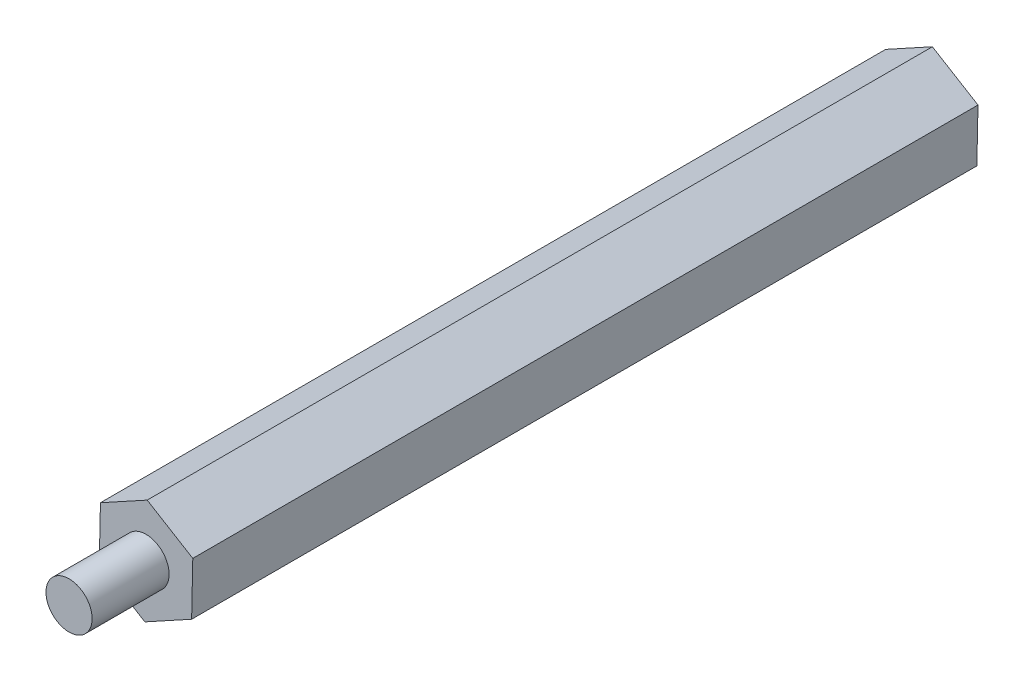
ISO-10303-21;
HEADER;
FILE_DESCRIPTION(('STEP AP214'),'2;1');
FILE_NAME('part.step','',(''),(''),'','','');
FILE_SCHEMA(('AUTOMOTIVE_DESIGN { 1 0 10303 214 1 1 1 1 }'));
ENDSEC;
DATA;
#1=APPLICATION_CONTEXT('core data for automotive mechanical design processes');
#2=APPLICATION_PROTOCOL_DEFINITION('international standard','automotive_design',2000,#1);
#3=PRODUCT_CONTEXT('',#1,'mechanical');
#4=PRODUCT('Part','Part','',(#3));
#5=PRODUCT_RELATED_PRODUCT_CATEGORY('part','',(#4));
#6=PRODUCT_DEFINITION_FORMATION('','',#4);
#7=PRODUCT_DEFINITION_CONTEXT('part definition',#1,'design');
#8=PRODUCT_DEFINITION('design','',#6,#7);
#9=PRODUCT_DEFINITION_SHAPE('','',#8);
#10=(LENGTH_UNIT() NAMED_UNIT(*) SI_UNIT(.MILLI.,.METRE.));
#11=(NAMED_UNIT(*) PLANE_ANGLE_UNIT() SI_UNIT($,.RADIAN.));
#12=(NAMED_UNIT(*) SI_UNIT($,.STERADIAN.) SOLID_ANGLE_UNIT());
#13=UNCERTAINTY_MEASURE_WITH_UNIT(LENGTH_MEASURE(1.E-05),#10,'distance_accuracy_value','');
#14=(GEOMETRIC_REPRESENTATION_CONTEXT(3) GLOBAL_UNCERTAINTY_ASSIGNED_CONTEXT((#13)) GLOBAL_UNIT_ASSIGNED_CONTEXT((#10,
#11,#12)) REPRESENTATION_CONTEXT('',''));
#15=CARTESIAN_POINT('',(0.,0.,0.));
#16=DIRECTION('',(0.,0.,1.));
#17=DIRECTION('',(1.,0.,0.));
#18=AXIS2_PLACEMENT_3D('',#15,#16,#17);
#19=CARTESIAN_POINT('',(16.5868309752007,13.0265330086215,2.5));
#20=DIRECTION('',(0.,0.,1.));
#21=DIRECTION('',(1.,0.,0.));
#22=AXIS2_PLACEMENT_3D('',#19,#20,#21);
#23=PLANE('',#22);
#24=CARTESIAN_POINT('',(16.5868309752007,13.0265330086215,2.5));
#25=DIRECTION('',(0.,0.,1.));
#26=DIRECTION('',(-1.,0.,0.));
#27=AXIS2_PLACEMENT_3D('',#24,#25,#26);
#28=CIRCLE('',#27,1.5);
#29=CARTESIAN_POINT('',(18.0868309752007,13.0265330086215,2.5));
#30=VERTEX_POINT('',#29);
#31=EDGE_CURVE('E146',#30,#30,#28,.T.);
#32=ORIENTED_EDGE('',*,*,#31,.T.);
#33=EDGE_LOOP('',(#32));
#34=FACE_BOUND('',#33,.T.);
#35=DIRECTION('',(0.0216605255586804,0.999765383293762,0.));
#36=VECTOR('',#35,1.);
#37=CARTESIAN_POINT('',(19.5486099942957,11.2299069924321,2.5));
#38=LINE('',#37,#36);
#39=CARTESIAN_POINT('',(19.5486099942957,11.2299069924321,2.5));
#40=VERTEX_POINT('',#39);
#41=CARTESIAN_POINT('',(19.6236442558682,14.6931958714589,2.5));
#42=VERTEX_POINT('',#41);
#43=EDGE_CURVE('E27',#40,#42,#38,.T.);
#44=ORIENTED_EDGE('',*,*,#43,.F.);
#45=DIRECTION('',(0.876652482536024,0.481124126253741,0.));
#46=VECTOR('',#45,1.);
#47=CARTESIAN_POINT('',(16.5117967136281,9.56324412959481,2.5));
#48=LINE('',#47,#46);
#49=CARTESIAN_POINT('',(16.5117967136281,9.56324412959481,2.5));
#50=VERTEX_POINT('',#49);
#51=EDGE_CURVE('E110',#50,#40,#48,.T.);
#52=ORIENTED_EDGE('',*,*,#51,.F.);
#53=DIRECTION('',(0.854991956977344,-0.51864125704002,0.));
#54=VECTOR('',#53,1.);
#55=CARTESIAN_POINT('',(13.5500176945331,11.3598701457842,2.5));
#56=LINE('',#55,#54);
#57=CARTESIAN_POINT('',(13.5500176945331,11.3598701457842,2.5));
#58=VERTEX_POINT('',#57);
#59=EDGE_CURVE('E150',#58,#50,#56,.T.);
#60=ORIENTED_EDGE('',*,*,#59,.F.);
#61=DIRECTION('',(-0.0216605255586804,-0.999765383293762,0.));
#62=VECTOR('',#61,1.);
#63=CARTESIAN_POINT('',(13.6250519561057,14.823159024811,2.5));
#64=LINE('',#63,#62);
#65=CARTESIAN_POINT('',(13.6250519561057,14.823159024811,2.5));
#66=VERTEX_POINT('',#65);
#67=EDGE_CURVE('E62',#66,#58,#64,.T.);
#68=ORIENTED_EDGE('',*,*,#67,.F.);
#69=DIRECTION('',(-0.876652482536024,-0.481124126253741,0.));
#70=VECTOR('',#69,1.);
#71=CARTESIAN_POINT('',(16.6618652367732,16.4898218876483,2.5));
#72=LINE('',#71,#70);
#73=CARTESIAN_POINT('',(16.6618652367732,16.4898218876483,2.5));
#74=VERTEX_POINT('',#73);
#75=EDGE_CURVE('E182',#74,#66,#72,.T.);
#76=ORIENTED_EDGE('',*,*,#75,.F.);
#77=DIRECTION('',(-0.854991956977344,0.51864125704002,0.));
#78=VECTOR('',#77,1.);
#79=CARTESIAN_POINT('',(19.6236442558682,14.6931958714589,2.5));
#80=LINE('',#79,#78);
#81=EDGE_CURVE('E112',#42,#74,#80,.T.);
#82=ORIENTED_EDGE('',*,*,#81,.F.);
#83=EDGE_LOOP('',(#44,#52,#60,#68,#76,#82));
#84=FACE_BOUND('',#83,.T.);
#85=ADVANCED_FACE('F16',(#34,#84),#23,.F.);
#86=CARTESIAN_POINT('',(16.5868309752007,13.0265330086215,53.5));
#87=DIRECTION('',(0.,0.,1.));
#88=DIRECTION('',(1.,0.,0.));
#89=AXIS2_PLACEMENT_3D('',#86,#87,#88);
#90=PLANE('',#89);
#91=CARTESIAN_POINT('',(16.5868309752007,13.0265330086215,53.5));
#92=DIRECTION('',(0.,0.,-1.));
#93=DIRECTION('',(-1.,0.,0.));
#94=AXIS2_PLACEMENT_3D('',#91,#92,#93);
#95=CIRCLE('',#94,1.5);
#96=CARTESIAN_POINT('',(18.0868309752007,13.0265330086215,53.5));
#97=VERTEX_POINT('',#96);
#98=EDGE_CURVE('E145',#97,#97,#95,.T.);
#99=ORIENTED_EDGE('',*,*,#98,.T.);
#100=EDGE_LOOP('',(#99));
#101=FACE_BOUND('',#100,.T.);
#102=DIRECTION('',(0.0216605255586804,0.999765383293762,0.));
#103=VECTOR('',#102,1.);
#104=CARTESIAN_POINT('',(19.5486099942957,11.2299069924321,53.5));
#105=LINE('',#104,#103);
#106=CARTESIAN_POINT('',(19.5486099942957,11.2299069924321,53.5));
#107=VERTEX_POINT('',#106);
#108=CARTESIAN_POINT('',(19.6236442558682,14.6931958714589,53.5));
#109=VERTEX_POINT('',#108);
#110=EDGE_CURVE('E11',#107,#109,#105,.T.);
#111=ORIENTED_EDGE('',*,*,#110,.T.);
#112=DIRECTION('',(-0.854991956977344,0.51864125704002,0.));
#113=VECTOR('',#112,1.);
#114=CARTESIAN_POINT('',(19.6236442558682,14.6931958714589,53.5));
#115=LINE('',#114,#113);
#116=CARTESIAN_POINT('',(16.6618652367732,16.4898218876483,53.5));
#117=VERTEX_POINT('',#116);
#118=EDGE_CURVE('E164',#109,#117,#115,.T.);
#119=ORIENTED_EDGE('',*,*,#118,.T.);
#120=DIRECTION('',(-0.876652482536024,-0.481124126253741,0.));
#121=VECTOR('',#120,1.);
#122=CARTESIAN_POINT('',(16.6618652367732,16.4898218876483,53.5));
#123=LINE('',#122,#121);
#124=CARTESIAN_POINT('',(13.6250519561057,14.823159024811,53.5));
#125=VERTEX_POINT('',#124);
#126=EDGE_CURVE('E161',#117,#125,#123,.T.);
#127=ORIENTED_EDGE('',*,*,#126,.T.);
#128=DIRECTION('',(-0.0216605255586804,-0.999765383293762,0.));
#129=VECTOR('',#128,1.);
#130=CARTESIAN_POINT('',(13.6250519561057,14.823159024811,53.5));
#131=LINE('',#130,#129);
#132=CARTESIAN_POINT('',(13.5500176945331,11.3598701457842,53.5));
#133=VERTEX_POINT('',#132);
#134=EDGE_CURVE('E155',#125,#133,#131,.T.);
#135=ORIENTED_EDGE('',*,*,#134,.T.);
#136=DIRECTION('',(0.854991956977344,-0.51864125704002,0.));
#137=VECTOR('',#136,1.);
#138=CARTESIAN_POINT('',(13.5500176945331,11.3598701457842,53.5));
#139=LINE('',#138,#137);
#140=CARTESIAN_POINT('',(16.5117967136281,9.56324412959481,53.5));
#141=VERTEX_POINT('',#140);
#142=EDGE_CURVE('E75',#133,#141,#139,.T.);
#143=ORIENTED_EDGE('',*,*,#142,.T.);
#144=DIRECTION('',(0.876652482536024,0.481124126253741,0.));
#145=VECTOR('',#144,1.);
#146=CARTESIAN_POINT('',(16.5117967136281,9.56324412959481,53.5));
#147=LINE('',#146,#145);
#148=EDGE_CURVE('E124',#141,#107,#147,.T.);
#149=ORIENTED_EDGE('',*,*,#148,.T.);
#150=EDGE_LOOP('',(#111,#119,#127,#135,#143,#149));
#151=FACE_BOUND('',#150,.T.);
#152=ADVANCED_FACE('F204',(#101,#151),#90,.T.);
#153=CARTESIAN_POINT('',(19.5486099942957,11.2299069924321,2.5));
#154=DIRECTION('',(0.999765383293761,-0.0216605255586804,0.));
#155=DIRECTION('',(0.,0.,-1.));
#156=AXIS2_PLACEMENT_3D('',#153,#154,#155);
#157=PLANE('',#156);
#158=ORIENTED_EDGE('',*,*,#43,.T.);
#159=DIRECTION('',(0.,0.,1.));
#160=VECTOR('',#159,1.);
#161=CARTESIAN_POINT('',(19.6236442558682,14.6931958714589,2.5));
#162=LINE('',#161,#160);
#163=EDGE_CURVE('E116',#42,#109,#162,.T.);
#164=ORIENTED_EDGE('',*,*,#163,.T.);
#165=ORIENTED_EDGE('',*,*,#110,.F.);
#166=DIRECTION('',(0.,0.,1.));
#167=VECTOR('',#166,1.);
#168=CARTESIAN_POINT('',(19.5486099942957,11.2299069924321,2.5));
#169=LINE('',#168,#167);
#170=EDGE_CURVE('E119',#40,#107,#169,.T.);
#171=ORIENTED_EDGE('',*,*,#170,.F.);
#172=EDGE_LOOP('',(#158,#164,#165,#171));
#173=FACE_BOUND('',#172,.T.);
#174=ADVANCED_FACE('F120',(#173),#157,.T.);
#175=CARTESIAN_POINT('',(19.6236442558682,14.6931958714589,2.5));
#176=DIRECTION('',(0.51864125704002,0.854991956977344,0.));
#177=DIRECTION('',(0.,0.,-1.));
#178=AXIS2_PLACEMENT_3D('',#175,#176,#177);
#179=PLANE('',#178);
#180=ORIENTED_EDGE('',*,*,#81,.T.);
#181=DIRECTION('',(0.,0.,1.));
#182=VECTOR('',#181,1.);
#183=CARTESIAN_POINT('',(16.6618652367732,16.4898218876483,2.5));
#184=LINE('',#183,#182);
#185=EDGE_CURVE('E157',#74,#117,#184,.T.);
#186=ORIENTED_EDGE('',*,*,#185,.T.);
#187=ORIENTED_EDGE('',*,*,#118,.F.);
#188=ORIENTED_EDGE('',*,*,#163,.F.);
#189=EDGE_LOOP('',(#180,#186,#187,#188));
#190=FACE_BOUND('',#189,.T.);
#191=ADVANCED_FACE('F188',(#190),#179,.T.);
#192=CARTESIAN_POINT('',(16.6618652367732,16.4898218876483,2.5));
#193=DIRECTION('',(-0.481124126253742,0.876652482536024,0.));
#194=DIRECTION('',(0.,0.,1.));
#195=AXIS2_PLACEMENT_3D('',#192,#193,#194);
#196=PLANE('',#195);
#197=ORIENTED_EDGE('',*,*,#75,.T.);
#198=DIRECTION('',(0.,0.,1.));
#199=VECTOR('',#198,1.);
#200=CARTESIAN_POINT('',(13.6250519561057,14.823159024811,2.5));
#201=LINE('',#200,#199);
#202=EDGE_CURVE('E171',#66,#125,#201,.T.);
#203=ORIENTED_EDGE('',*,*,#202,.T.);
#204=ORIENTED_EDGE('',*,*,#126,.F.);
#205=ORIENTED_EDGE('',*,*,#185,.F.);
#206=EDGE_LOOP('',(#197,#203,#204,#205));
#207=FACE_BOUND('',#206,.T.);
#208=ADVANCED_FACE('F192',(#207),#196,.T.);
#209=CARTESIAN_POINT('',(13.6250519561057,14.823159024811,2.5));
#210=DIRECTION('',(-0.999765383293761,0.0216605255586804,0.));
#211=DIRECTION('',(0.,0.,1.));
#212=AXIS2_PLACEMENT_3D('',#209,#210,#211);
#213=PLANE('',#212);
#214=ORIENTED_EDGE('',*,*,#67,.T.);
#215=DIRECTION('',(0.,0.,1.));
#216=VECTOR('',#215,1.);
#217=CARTESIAN_POINT('',(13.5500176945331,11.3598701457842,2.5));
#218=LINE('',#217,#216);
#219=EDGE_CURVE('E156',#58,#133,#218,.T.);
#220=ORIENTED_EDGE('',*,*,#219,.T.);
#221=ORIENTED_EDGE('',*,*,#134,.F.);
#222=ORIENTED_EDGE('',*,*,#202,.F.);
#223=EDGE_LOOP('',(#214,#220,#221,#222));
#224=FACE_BOUND('',#223,.T.);
#225=ADVANCED_FACE('F18',(#224),#213,.T.);
#226=CARTESIAN_POINT('',(13.5500176945331,11.3598701457842,2.5));
#227=DIRECTION('',(-0.51864125704002,-0.854991956977344,0.));
#228=DIRECTION('',(-0.854991956977344,0.51864125704002,0.));
#229=AXIS2_PLACEMENT_3D('',#226,#227,#228);
#230=PLANE('',#229);
#231=ORIENTED_EDGE('',*,*,#59,.T.);
#232=DIRECTION('',(0.,0.,1.));
#233=VECTOR('',#232,1.);
#234=CARTESIAN_POINT('',(16.5117967136281,9.56324412959481,2.5));
#235=LINE('',#234,#233);
#236=EDGE_CURVE('E128',#50,#141,#235,.T.);
#237=ORIENTED_EDGE('',*,*,#236,.T.);
#238=ORIENTED_EDGE('',*,*,#142,.F.);
#239=ORIENTED_EDGE('',*,*,#219,.F.);
#240=EDGE_LOOP('',(#231,#237,#238,#239));
#241=FACE_BOUND('',#240,.T.);
#242=ADVANCED_FACE('F224',(#241),#230,.T.);
#243=CARTESIAN_POINT('',(16.5117967136281,9.56324412959481,2.5));
#244=DIRECTION('',(0.481124126253742,-0.876652482536024,0.));
#245=DIRECTION('',(0.,0.,-1.));
#246=AXIS2_PLACEMENT_3D('',#243,#244,#245);
#247=PLANE('',#246);
#248=ORIENTED_EDGE('',*,*,#51,.T.);
#249=ORIENTED_EDGE('',*,*,#170,.T.);
#250=ORIENTED_EDGE('',*,*,#148,.F.);
#251=ORIENTED_EDGE('',*,*,#236,.F.);
#252=EDGE_LOOP('',(#248,#249,#250,#251));
#253=FACE_BOUND('',#252,.T.);
#254=ADVANCED_FACE('F127',(#253),#247,.T.);
#255=CARTESIAN_POINT('',(16.5868309752007,13.0265330086215,7.5));
#256=DIRECTION('',(0.,0.,1.));
#257=DIRECTION('',(1.,0.,0.));
#258=AXIS2_PLACEMENT_3D('',#255,#256,#257);
#259=PLANE('',#258);
#260=CARTESIAN_POINT('',(16.5868309752007,13.0265330086215,7.5));
#261=DIRECTION('',(0.,0.,1.));
#262=DIRECTION('',(-1.,0.,0.));
#263=AXIS2_PLACEMENT_3D('',#260,#261,#262);
#264=CIRCLE('',#263,1.5);
#265=CARTESIAN_POINT('',(18.0868309752007,13.0265330086215,7.5));
#266=VERTEX_POINT('',#265);
#267=EDGE_CURVE('E130',#266,#266,#264,.T.);
#268=ORIENTED_EDGE('',*,*,#267,.F.);
#269=EDGE_LOOP('',(#268));
#270=FACE_BOUND('',#269,.T.);
#271=ADVANCED_FACE('F230',(#270),#259,.F.);
#272=CARTESIAN_POINT('',(16.5868309752007,13.0265330086215,2.5));
#273=DIRECTION('',(0.,0.,1.));
#274=DIRECTION('',(-1.,0.,0.));
#275=AXIS2_PLACEMENT_3D('',#272,#273,#274);
#276=CYLINDRICAL_SURFACE('',#275,1.5);
#277=ORIENTED_EDGE('',*,*,#31,.F.);
#278=DIRECTION('',(0.,0.,1.));
#279=VECTOR('',#278,1.);
#280=CARTESIAN_POINT('',(18.0868309752007,13.0265330086215,2.5));
#281=LINE('',#280,#279);
#282=EDGE_CURVE('E137',#30,#266,#281,.T.);
#283=ORIENTED_EDGE('',*,*,#282,.T.);
#284=ORIENTED_EDGE('',*,*,#267,.T.);
#285=ORIENTED_EDGE('',*,*,#282,.F.);
#286=EDGE_LOOP('',(#277,#283,#284,#285));
#287=FACE_BOUND('',#286,.T.);
#288=ADVANCED_FACE('F222',(#287),#276,.F.);
#289=CARTESIAN_POINT('',(16.5868309752007,13.0265330086215,58.5));
#290=DIRECTION('',(0.,0.,1.));
#291=DIRECTION('',(1.,0.,0.));
#292=AXIS2_PLACEMENT_3D('',#289,#290,#291);
#293=PLANE('',#292);
#294=CARTESIAN_POINT('',(16.5868309752007,13.0265330086215,58.5));
#295=DIRECTION('',(0.,0.,1.));
#296=DIRECTION('',(-1.,0.,0.));
#297=AXIS2_PLACEMENT_3D('',#294,#295,#296);
#298=CIRCLE('',#297,1.5);
#299=CARTESIAN_POINT('',(18.0868309752007,13.0265330086215,58.5));
#300=VERTEX_POINT('',#299);
#301=EDGE_CURVE('E20',#300,#300,#298,.T.);
#302=ORIENTED_EDGE('',*,*,#301,.T.);
#303=EDGE_LOOP('',(#302));
#304=FACE_BOUND('',#303,.T.);
#305=ADVANCED_FACE('F218',(#304),#293,.T.);
#306=CARTESIAN_POINT('',(16.5868309752007,13.0265330086215,2.5));
#307=DIRECTION('',(0.,0.,1.));
#308=DIRECTION('',(-1.,0.,0.));
#309=AXIS2_PLACEMENT_3D('',#306,#307,#308);
#310=CYLINDRICAL_SURFACE('',#309,1.5);
#311=ORIENTED_EDGE('',*,*,#301,.F.);
#312=DIRECTION('',(0.,0.,-1.));
#313=VECTOR('',#312,1.);
#314=CARTESIAN_POINT('',(18.0868309752007,13.0265330086215,2.5));
#315=LINE('',#314,#313);
#316=EDGE_CURVE('E141',#300,#97,#315,.T.);
#317=ORIENTED_EDGE('',*,*,#316,.T.);
#318=ORIENTED_EDGE('',*,*,#98,.F.);
#319=ORIENTED_EDGE('',*,*,#316,.F.);
#320=EDGE_LOOP('',(#311,#317,#318,#319));
#321=FACE_BOUND('',#320,.T.);
#322=ADVANCED_FACE('F221',(#321),#310,.T.);
#323=CLOSED_SHELL('',(#85,#152,#174,#191,#208,#225,#242,#254,#271,#288,#305,#322));
#324=MANIFOLD_SOLID_BREP('B1',#323);
#325=ADVANCED_BREP_SHAPE_REPRESENTATION('',(#18,#324),#14);
#326=SHAPE_DEFINITION_REPRESENTATION(#9,#325);
ENDSEC;
END-ISO-10303-21;
